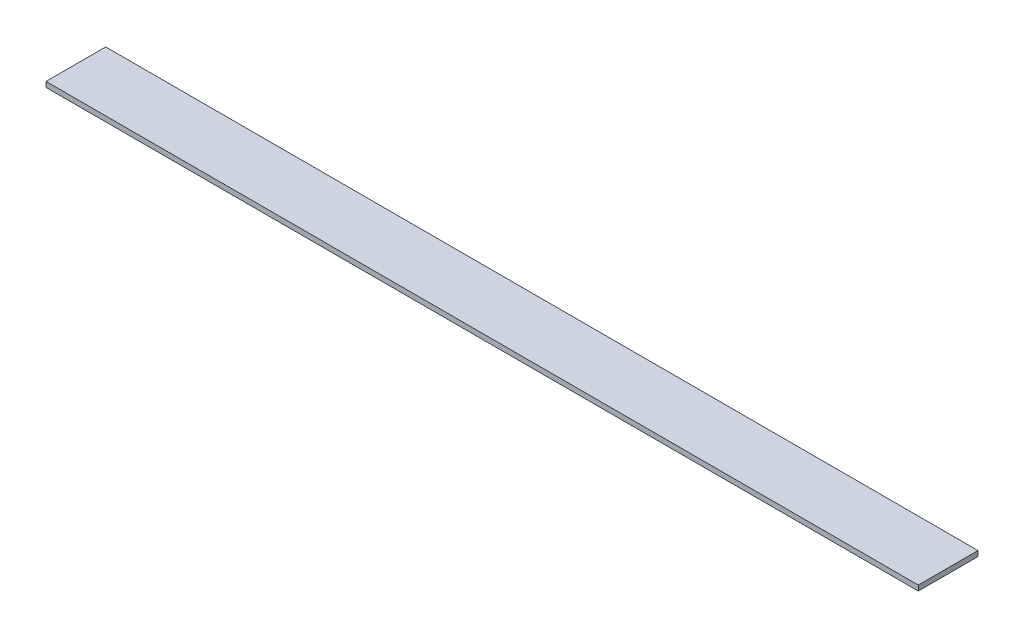
ISO-10303-21;
HEADER;
FILE_DESCRIPTION(('STEP AP214'),'2;1');
FILE_NAME('part.step','',(''),(''),'','','');
FILE_SCHEMA(('AUTOMOTIVE_DESIGN { 1 0 10303 214 1 1 1 1 }'));
ENDSEC;
DATA;
#1=APPLICATION_CONTEXT('core data for automotive mechanical design processes');
#2=APPLICATION_PROTOCOL_DEFINITION('international standard','automotive_design',2000,#1);
#3=PRODUCT_CONTEXT('',#1,'mechanical');
#4=PRODUCT('Part','Part','',(#3));
#5=PRODUCT_RELATED_PRODUCT_CATEGORY('part','',(#4));
#6=PRODUCT_DEFINITION_FORMATION('','',#4);
#7=PRODUCT_DEFINITION_CONTEXT('part definition',#1,'design');
#8=PRODUCT_DEFINITION('design','',#6,#7);
#9=PRODUCT_DEFINITION_SHAPE('','',#8);
#10=(LENGTH_UNIT() NAMED_UNIT(*) SI_UNIT(.MILLI.,.METRE.));
#11=(NAMED_UNIT(*) PLANE_ANGLE_UNIT() SI_UNIT($,.RADIAN.));
#12=(NAMED_UNIT(*) SI_UNIT($,.STERADIAN.) SOLID_ANGLE_UNIT());
#13=UNCERTAINTY_MEASURE_WITH_UNIT(LENGTH_MEASURE(1.E-05),#10,'distance_accuracy_value','');
#14=(GEOMETRIC_REPRESENTATION_CONTEXT(3) GLOBAL_UNCERTAINTY_ASSIGNED_CONTEXT((#13)) GLOBAL_UNIT_ASSIGNED_CONTEXT((#10,
#11,#12)) REPRESENTATION_CONTEXT('',''));
#15=CARTESIAN_POINT('',(0.,0.,0.));
#16=DIRECTION('',(0.,0.,1.));
#17=DIRECTION('',(1.,0.,0.));
#18=AXIS2_PLACEMENT_3D('',#15,#16,#17);
#19=CARTESIAN_POINT('',(-29.767690826579,1.5748,9.85640651258569));
#20=DIRECTION('',(1.,0.,0.));
#21=DIRECTION('',(0.,0.,-1.));
#22=AXIS2_PLACEMENT_3D('',#19,#20,#21);
#23=PLANE('',#22);
#24=DIRECTION('',(0.,0.,1.));
#25=VECTOR('',#24,1.);
#26=CARTESIAN_POINT('',(-29.767690826579,0.,9.85640651258569));
#27=LINE('',#26,#25);
#28=CARTESIAN_POINT('',(-29.767690826579,0.,-8.14359348741431));
#29=VERTEX_POINT('',#28);
#30=CARTESIAN_POINT('',(-29.767690826579,0.,9.85640651258569));
#31=VERTEX_POINT('',#30);
#32=EDGE_CURVE('E97',#29,#31,#27,.T.);
#33=ORIENTED_EDGE('',*,*,#32,.T.);
#34=DIRECTION('',(0.,-1.,0.));
#35=VECTOR('',#34,1.);
#36=CARTESIAN_POINT('',(-29.767690826579,1.5748,9.85640651258569));
#37=LINE('',#36,#35);
#38=CARTESIAN_POINT('',(-29.767690826579,1.5748,9.85640651258569));
#39=VERTEX_POINT('',#38);
#40=EDGE_CURVE('E11',#39,#31,#37,.T.);
#41=ORIENTED_EDGE('',*,*,#40,.F.);
#42=DIRECTION('',(0.,0.,1.));
#43=VECTOR('',#42,1.);
#44=CARTESIAN_POINT('',(-29.767690826579,1.5748,9.85640651258569));
#45=LINE('',#44,#43);
#46=CARTESIAN_POINT('',(-29.767690826579,1.5748,-8.14359348741431));
#47=VERTEX_POINT('',#46);
#48=EDGE_CURVE('E85',#47,#39,#45,.T.);
#49=ORIENTED_EDGE('',*,*,#48,.F.);
#50=DIRECTION('',(0.,-1.,0.));
#51=VECTOR('',#50,1.);
#52=CARTESIAN_POINT('',(-29.767690826579,1.5748,-8.14359348741431));
#53=LINE('',#52,#51);
#54=EDGE_CURVE('E93',#47,#29,#53,.T.);
#55=ORIENTED_EDGE('',*,*,#54,.T.);
#56=EDGE_LOOP('',(#33,#41,#49,#55));
#57=FACE_BOUND('',#56,.T.);
#58=ADVANCED_FACE('F34',(#57),#23,.F.);
#59=CARTESIAN_POINT('',(-29.767690826579,1.5748,9.85640651258569));
#60=DIRECTION('',(0.,0.,-1.));
#61=DIRECTION('',(-1.,0.,0.));
#62=AXIS2_PLACEMENT_3D('',#59,#60,#61);
#63=PLANE('',#62);
#64=DIRECTION('',(1.,0.,0.));
#65=VECTOR('',#64,1.);
#66=CARTESIAN_POINT('',(-29.767690826579,0.,9.85640651258569));
#67=LINE('',#66,#65);
#68=CARTESIAN_POINT('',(233.232309173421,0.,9.85640651258569));
#69=VERTEX_POINT('',#68);
#70=EDGE_CURVE('E89',#31,#69,#67,.T.);
#71=ORIENTED_EDGE('',*,*,#70,.T.);
#72=DIRECTION('',(0.,-1.,0.));
#73=VECTOR('',#72,1.);
#74=CARTESIAN_POINT('',(233.232309173421,1.5748,9.85640651258569));
#75=LINE('',#74,#73);
#76=CARTESIAN_POINT('',(233.232309173421,1.5748,9.85640651258569));
#77=VERTEX_POINT('',#76);
#78=EDGE_CURVE('E42',#77,#69,#75,.T.);
#79=ORIENTED_EDGE('',*,*,#78,.F.);
#80=DIRECTION('',(1.,0.,0.));
#81=VECTOR('',#80,1.);
#82=CARTESIAN_POINT('',(-29.767690826579,1.5748,9.85640651258569));
#83=LINE('',#82,#81);
#84=EDGE_CURVE('E80',#39,#77,#83,.T.);
#85=ORIENTED_EDGE('',*,*,#84,.F.);
#86=ORIENTED_EDGE('',*,*,#40,.T.);
#87=EDGE_LOOP('',(#71,#79,#85,#86));
#88=FACE_BOUND('',#87,.T.);
#89=ADVANCED_FACE('F88',(#88),#63,.F.);
#90=CARTESIAN_POINT('',(233.232309173421,1.5748,9.85640651258569));
#91=DIRECTION('',(-1.,0.,0.));
#92=DIRECTION('',(0.,0.,1.));
#93=AXIS2_PLACEMENT_3D('',#90,#91,#92);
#94=PLANE('',#93);
#95=DIRECTION('',(0.,0.,-1.));
#96=VECTOR('',#95,1.);
#97=CARTESIAN_POINT('',(233.232309173421,0.,9.85640651258569));
#98=LINE('',#97,#96);
#99=CARTESIAN_POINT('',(233.232309173421,0.,-8.14359348741431));
#100=VERTEX_POINT('',#99);
#101=EDGE_CURVE('E67',#69,#100,#98,.T.);
#102=ORIENTED_EDGE('',*,*,#101,.T.);
#103=DIRECTION('',(0.,-1.,0.));
#104=VECTOR('',#103,1.);
#105=CARTESIAN_POINT('',(233.232309173421,1.5748,-8.14359348741431));
#106=LINE('',#105,#104);
#107=CARTESIAN_POINT('',(233.232309173421,1.5748,-8.14359348741431));
#108=VERTEX_POINT('',#107);
#109=EDGE_CURVE('E90',#108,#100,#106,.T.);
#110=ORIENTED_EDGE('',*,*,#109,.F.);
#111=DIRECTION('',(0.,0.,-1.));
#112=VECTOR('',#111,1.);
#113=CARTESIAN_POINT('',(233.232309173421,1.5748,9.85640651258569));
#114=LINE('',#113,#112);
#115=EDGE_CURVE('E83',#77,#108,#114,.T.);
#116=ORIENTED_EDGE('',*,*,#115,.F.);
#117=ORIENTED_EDGE('',*,*,#78,.T.);
#118=EDGE_LOOP('',(#102,#110,#116,#117));
#119=FACE_BOUND('',#118,.T.);
#120=ADVANCED_FACE('F91',(#119),#94,.F.);
#121=CARTESIAN_POINT('',(-29.767690826579,1.5748,-8.14359348741431));
#122=DIRECTION('',(0.,0.,1.));
#123=DIRECTION('',(1.,0.,0.));
#124=AXIS2_PLACEMENT_3D('',#121,#122,#123);
#125=PLANE('',#124);
#126=DIRECTION('',(-1.,0.,0.));
#127=VECTOR('',#126,1.);
#128=CARTESIAN_POINT('',(-29.767690826579,0.,-8.14359348741431));
#129=LINE('',#128,#127);
#130=EDGE_CURVE('E73',#100,#29,#129,.T.);
#131=ORIENTED_EDGE('',*,*,#130,.T.);
#132=ORIENTED_EDGE('',*,*,#54,.F.);
#133=DIRECTION('',(-1.,0.,0.));
#134=VECTOR('',#133,1.);
#135=CARTESIAN_POINT('',(-29.767690826579,1.5748,-8.14359348741431));
#136=LINE('',#135,#134);
#137=EDGE_CURVE('E50',#108,#47,#136,.T.);
#138=ORIENTED_EDGE('',*,*,#137,.F.);
#139=ORIENTED_EDGE('',*,*,#109,.T.);
#140=EDGE_LOOP('',(#131,#132,#138,#139));
#141=FACE_BOUND('',#140,.T.);
#142=ADVANCED_FACE('F104',(#141),#125,.F.);
#143=CARTESIAN_POINT('',(0.,1.5748,0.));
#144=DIRECTION('',(0.,-1.,0.));
#145=DIRECTION('',(0.,0.,-1.));
#146=AXIS2_PLACEMENT_3D('',#143,#144,#145);
#147=PLANE('',#146);
#148=ORIENTED_EDGE('',*,*,#48,.T.);
#149=ORIENTED_EDGE('',*,*,#84,.T.);
#150=ORIENTED_EDGE('',*,*,#115,.T.);
#151=ORIENTED_EDGE('',*,*,#137,.T.);
#152=EDGE_LOOP('',(#148,#149,#150,#151));
#153=FACE_BOUND('',#152,.T.);
#154=ADVANCED_FACE('F81',(#153),#147,.F.);
#155=CARTESIAN_POINT('',(0.,0.,0.));
#156=DIRECTION('',(0.,-1.,0.));
#157=DIRECTION('',(0.,0.,-1.));
#158=AXIS2_PLACEMENT_3D('',#155,#156,#157);
#159=PLANE('',#158);
#160=ORIENTED_EDGE('',*,*,#32,.F.);
#161=ORIENTED_EDGE('',*,*,#130,.F.);
#162=ORIENTED_EDGE('',*,*,#101,.F.);
#163=ORIENTED_EDGE('',*,*,#70,.F.);
#164=EDGE_LOOP('',(#160,#161,#162,#163));
#165=FACE_BOUND('',#164,.T.);
#166=ADVANCED_FACE('F107',(#165),#159,.T.);
#167=CLOSED_SHELL('',(#58,#89,#120,#142,#154,#166));
#168=MANIFOLD_SOLID_BREP('B2',#167);
#169=ADVANCED_BREP_SHAPE_REPRESENTATION('',(#18,#168),#14);
#170=SHAPE_DEFINITION_REPRESENTATION(#9,#169);
ENDSEC;
END-ISO-10303-21;
